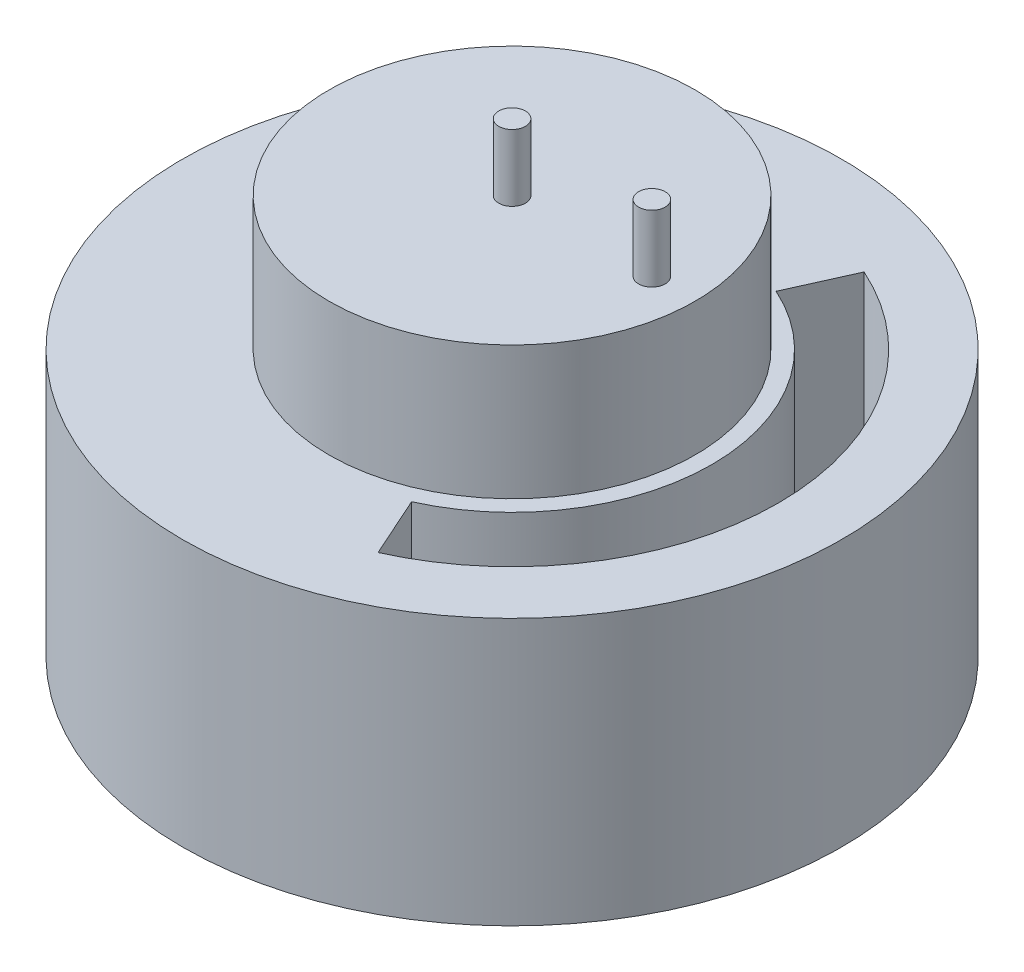
ISO-10303-21;
HEADER;
FILE_DESCRIPTION(('STEP AP214'),'2;1');
FILE_NAME('part.step','',(''),(''),'','','');
FILE_SCHEMA(('AUTOMOTIVE_DESIGN { 1 0 10303 214 1 1 1 1 }'));
ENDSEC;
DATA;
#1=APPLICATION_CONTEXT('core data for automotive mechanical design processes');
#2=APPLICATION_PROTOCOL_DEFINITION('international standard','automotive_design',2000,#1);
#3=PRODUCT_CONTEXT('',#1,'mechanical');
#4=PRODUCT('Part','Part','',(#3));
#5=PRODUCT_RELATED_PRODUCT_CATEGORY('part','',(#4));
#6=PRODUCT_DEFINITION_FORMATION('','',#4);
#7=PRODUCT_DEFINITION_CONTEXT('part definition',#1,'design');
#8=PRODUCT_DEFINITION('design','',#6,#7);
#9=PRODUCT_DEFINITION_SHAPE('','',#8);
#10=(LENGTH_UNIT() NAMED_UNIT(*) SI_UNIT(.MILLI.,.METRE.));
#11=(NAMED_UNIT(*) PLANE_ANGLE_UNIT() SI_UNIT($,.RADIAN.));
#12=(NAMED_UNIT(*) SI_UNIT($,.STERADIAN.) SOLID_ANGLE_UNIT());
#13=UNCERTAINTY_MEASURE_WITH_UNIT(LENGTH_MEASURE(1.E-05),#10,'distance_accuracy_value','');
#14=(GEOMETRIC_REPRESENTATION_CONTEXT(3) GLOBAL_UNCERTAINTY_ASSIGNED_CONTEXT((#13)) GLOBAL_UNIT_ASSIGNED_CONTEXT((#10,
#11,#12)) REPRESENTATION_CONTEXT('',''));
#15=CARTESIAN_POINT('',(0.,0.,0.));
#16=DIRECTION('',(0.,0.,1.));
#17=DIRECTION('',(1.,0.,0.));
#18=AXIS2_PLACEMENT_3D('',#15,#16,#17);
#19=CARTESIAN_POINT('',(0.,20.,0.));
#20=DIRECTION('',(0.,-1.,0.));
#21=DIRECTION('',(0.,0.,-1.));
#22=AXIS2_PLACEMENT_3D('',#19,#20,#21);
#23=CYLINDRICAL_SURFACE('',#22,24.75);
#24=CARTESIAN_POINT('',(0.,20.,0.));
#25=DIRECTION('',(0.,1.,0.));
#26=DIRECTION('',(0.,0.,1.));
#27=AXIS2_PLACEMENT_3D('',#24,#25,#26);
#28=CIRCLE('',#27,24.75);
#29=CARTESIAN_POINT('',(0.,20.,24.75));
#30=VERTEX_POINT('',#29);
#31=EDGE_CURVE('E50',#30,#30,#28,.T.);
#32=ORIENTED_EDGE('',*,*,#31,.F.);
#33=EDGE_LOOP('',(#32));
#34=FACE_BOUND('',#33,.T.);
#35=CARTESIAN_POINT('',(0.,0.,0.));
#36=DIRECTION('',(0.,1.,0.));
#37=DIRECTION('',(0.,0.,1.));
#38=AXIS2_PLACEMENT_3D('',#35,#36,#37);
#39=CIRCLE('',#38,24.75);
#40=CARTESIAN_POINT('',(0.,0.,24.75));
#41=VERTEX_POINT('',#40);
#42=EDGE_CURVE('E44',#41,#41,#39,.T.);
#43=ORIENTED_EDGE('',*,*,#42,.T.);
#44=EDGE_LOOP('',(#43));
#45=FACE_BOUND('',#44,.T.);
#46=ADVANCED_FACE('F41',(#34,#45),#23,.T.);
#47=CARTESIAN_POINT('',(0.,20.,0.));
#48=DIRECTION('',(0.,1.,0.));
#49=DIRECTION('',(0.,0.,1.));
#50=AXIS2_PLACEMENT_3D('',#47,#48,#49);
#51=PLANE('',#50);
#52=CARTESIAN_POINT('',(0.,20.,0.));
#53=DIRECTION('',(0.,-1.,0.));
#54=DIRECTION('',(0.,0.,1.));
#55=AXIS2_PLACEMENT_3D('',#52,#53,#54);
#56=CIRCLE('',#55,15.);
#57=CARTESIAN_POINT('',(6.13929231044262,20.,-13.6860911120356));
#58=VERTEX_POINT('',#57);
#59=CARTESIAN_POINT('',(6.13929231044262,20.,13.6860911120356));
#60=VERTEX_POINT('',#59);
#61=EDGE_CURVE('E58',#58,#60,#56,.T.);
#62=ORIENTED_EDGE('',*,*,#61,.F.);
#63=DIRECTION('',(-0.409286154029508,0.,0.912406074135707));
#64=VECTOR('',#63,1.);
#65=CARTESIAN_POINT('',(8.18572308059016,20.,-18.2481214827141));
#66=LINE('',#65,#64);
#67=CARTESIAN_POINT('',(8.18572308059016,20.,-18.2481214827141));
#68=VERTEX_POINT('',#67);
#69=EDGE_CURVE('E105',#68,#58,#66,.T.);
#70=ORIENTED_EDGE('',*,*,#69,.F.);
#71=CARTESIAN_POINT('',(0.,20.,0.));
#72=DIRECTION('',(0.,1.,0.));
#73=DIRECTION('',(0.,0.,1.));
#74=AXIS2_PLACEMENT_3D('',#71,#72,#73);
#75=CIRCLE('',#74,20.);
#76=CARTESIAN_POINT('',(8.18572308059016,20.,18.2481214827141));
#77=VERTEX_POINT('',#76);
#78=EDGE_CURVE('E87',#77,#68,#75,.T.);
#79=ORIENTED_EDGE('',*,*,#78,.F.);
#80=DIRECTION('',(0.409286154029508,0.,0.912406074135707));
#81=VECTOR('',#80,1.);
#82=CARTESIAN_POINT('',(8.18572308059016,20.,18.2481214827141));
#83=LINE('',#82,#81);
#84=EDGE_CURVE('E97',#60,#77,#83,.T.);
#85=ORIENTED_EDGE('',*,*,#84,.F.);
#86=EDGE_LOOP('',(#62,#70,#79,#85));
#87=FACE_BOUND('',#86,.T.);
#88=CARTESIAN_POINT('',(0.,20.,0.));
#89=DIRECTION('',(0.,1.,0.));
#90=DIRECTION('',(0.,0.,1.));
#91=AXIS2_PLACEMENT_3D('',#88,#89,#90);
#92=CIRCLE('',#91,13.75);
#93=CARTESIAN_POINT('',(0.,20.,13.75));
#94=VERTEX_POINT('',#93);
#95=EDGE_CURVE('E11',#94,#94,#92,.T.);
#96=ORIENTED_EDGE('',*,*,#95,.F.);
#97=EDGE_LOOP('',(#96));
#98=FACE_BOUND('',#97,.T.);
#99=ORIENTED_EDGE('',*,*,#31,.T.);
#100=EDGE_LOOP('',(#99));
#101=FACE_BOUND('',#100,.T.);
#102=ADVANCED_FACE('F102',(#87,#98,#101),#51,.T.);
#103=CARTESIAN_POINT('',(0.,0.,0.));
#104=DIRECTION('',(0.,1.,0.));
#105=DIRECTION('',(0.,0.,1.));
#106=AXIS2_PLACEMENT_3D('',#103,#104,#105);
#107=PLANE('',#106);
#108=DIRECTION('',(0.409286154029508,0.,-0.912406074135707));
#109=VECTOR('',#108,1.);
#110=CARTESIAN_POINT('',(8.18572308059016,0.,-18.2481214827141));
#111=LINE('',#110,#109);
#112=CARTESIAN_POINT('',(6.13929231044262,0.,-13.6860911120356));
#113=VERTEX_POINT('',#112);
#114=CARTESIAN_POINT('',(8.18572308059016,0.,-18.2481214827141));
#115=VERTEX_POINT('',#114);
#116=EDGE_CURVE('E282',#113,#115,#111,.T.);
#117=ORIENTED_EDGE('',*,*,#116,.F.);
#118=CARTESIAN_POINT('',(0.,0.,0.));
#119=DIRECTION('',(0.,1.,0.));
#120=DIRECTION('',(0.,0.,1.));
#121=AXIS2_PLACEMENT_3D('',#118,#119,#120);
#122=CIRCLE('',#121,15.);
#123=CARTESIAN_POINT('',(6.13929231044262,0.,13.6860911120356));
#124=VERTEX_POINT('',#123);
#125=EDGE_CURVE('E123',#124,#113,#122,.T.);
#126=ORIENTED_EDGE('',*,*,#125,.F.);
#127=DIRECTION('',(-0.409286154029508,0.,-0.912406074135707));
#128=VECTOR('',#127,1.);
#129=CARTESIAN_POINT('',(8.18572308059016,0.,18.2481214827141));
#130=LINE('',#129,#128);
#131=CARTESIAN_POINT('',(8.18572308059017,0.,18.2481214827142));
#132=VERTEX_POINT('',#131);
#133=EDGE_CURVE('E119',#132,#124,#130,.T.);
#134=ORIENTED_EDGE('',*,*,#133,.F.);
#135=CARTESIAN_POINT('',(0.,0.,0.));
#136=DIRECTION('',(0.,1.,0.));
#137=DIRECTION('',(0.,0.,1.));
#138=AXIS2_PLACEMENT_3D('',#135,#136,#137);
#139=CIRCLE('',#138,20.);
#140=EDGE_CURVE('E90',#115,#132,#139,.F.);
#141=ORIENTED_EDGE('',*,*,#140,.F.);
#142=EDGE_LOOP('',(#117,#126,#134,#141));
#143=FACE_BOUND('',#142,.T.);
#144=ORIENTED_EDGE('',*,*,#42,.F.);
#145=EDGE_LOOP('',(#144));
#146=FACE_BOUND('',#145,.T.);
#147=ADVANCED_FACE('F151',(#143,#146),#107,.F.);
#148=CARTESIAN_POINT('',(0.,30.,0.));
#149=DIRECTION('',(0.,-1.,0.));
#150=DIRECTION('',(0.,0.,-1.));
#151=AXIS2_PLACEMENT_3D('',#148,#149,#150);
#152=CYLINDRICAL_SURFACE('',#151,13.75);
#153=CARTESIAN_POINT('',(0.,30.,0.));
#154=DIRECTION('',(0.,1.,0.));
#155=DIRECTION('',(0.,0.,1.));
#156=AXIS2_PLACEMENT_3D('',#153,#154,#155);
#157=CIRCLE('',#156,13.75);
#158=CARTESIAN_POINT('',(0.,30.,13.75));
#159=VERTEX_POINT('',#158);
#160=EDGE_CURVE('E136',#159,#159,#157,.T.);
#161=ORIENTED_EDGE('',*,*,#160,.F.);
#162=EDGE_LOOP('',(#161));
#163=FACE_BOUND('',#162,.T.);
#164=ORIENTED_EDGE('',*,*,#95,.T.);
#165=EDGE_LOOP('',(#164));
#166=FACE_BOUND('',#165,.T.);
#167=ADVANCED_FACE('F153',(#163,#166),#152,.T.);
#168=CARTESIAN_POINT('',(0.,30.,0.));
#169=DIRECTION('',(0.,1.,0.));
#170=DIRECTION('',(0.,0.,1.));
#171=AXIS2_PLACEMENT_3D('',#168,#169,#170);
#172=PLANE('',#171);
#173=CARTESIAN_POINT('',(10.5,30.,0.));
#174=DIRECTION('',(0.,1.,0.));
#175=DIRECTION('',(0.,0.,1.));
#176=AXIS2_PLACEMENT_3D('',#173,#174,#175);
#177=CIRCLE('',#176,1.);
#178=CARTESIAN_POINT('',(10.5,30.,1.));
#179=VERTEX_POINT('',#178);
#180=EDGE_CURVE('E122',#179,#179,#177,.T.);
#181=ORIENTED_EDGE('',*,*,#180,.F.);
#182=EDGE_LOOP('',(#181));
#183=FACE_BOUND('',#182,.T.);
#184=CARTESIAN_POINT('',(0.,30.,0.));
#185=DIRECTION('',(0.,1.,0.));
#186=DIRECTION('',(0.,0.,1.));
#187=AXIS2_PLACEMENT_3D('',#184,#185,#186);
#188=CIRCLE('',#187,1.);
#189=CARTESIAN_POINT('',(0.,30.,1.));
#190=VERTEX_POINT('',#189);
#191=EDGE_CURVE('E128',#190,#190,#188,.T.);
#192=ORIENTED_EDGE('',*,*,#191,.F.);
#193=EDGE_LOOP('',(#192));
#194=FACE_BOUND('',#193,.T.);
#195=ORIENTED_EDGE('',*,*,#160,.T.);
#196=EDGE_LOOP('',(#195));
#197=FACE_BOUND('',#196,.T.);
#198=ADVANCED_FACE('F159',(#183,#194,#197),#172,.T.);
#199=CARTESIAN_POINT('',(0.,35.,0.));
#200=DIRECTION('',(0.,-1.,0.));
#201=DIRECTION('',(0.,0.,-1.));
#202=AXIS2_PLACEMENT_3D('',#199,#200,#201);
#203=CYLINDRICAL_SURFACE('',#202,1.);
#204=CARTESIAN_POINT('',(0.,35.,0.));
#205=DIRECTION('',(0.,1.,0.));
#206=DIRECTION('',(0.,0.,1.));
#207=AXIS2_PLACEMENT_3D('',#204,#205,#206);
#208=CIRCLE('',#207,1.);
#209=CARTESIAN_POINT('',(0.,35.,1.));
#210=VERTEX_POINT('',#209);
#211=EDGE_CURVE('E132',#210,#210,#208,.T.);
#212=ORIENTED_EDGE('',*,*,#211,.F.);
#213=EDGE_LOOP('',(#212));
#214=FACE_BOUND('',#213,.T.);
#215=ORIENTED_EDGE('',*,*,#191,.T.);
#216=EDGE_LOOP('',(#215));
#217=FACE_BOUND('',#216,.T.);
#218=ADVANCED_FACE('F233',(#214,#217),#203,.T.);
#219=CARTESIAN_POINT('',(0.,35.,0.));
#220=DIRECTION('',(0.,1.,0.));
#221=DIRECTION('',(0.,0.,1.));
#222=AXIS2_PLACEMENT_3D('',#219,#220,#221);
#223=PLANE('',#222);
#224=ORIENTED_EDGE('',*,*,#211,.T.);
#225=EDGE_LOOP('',(#224));
#226=FACE_BOUND('',#225,.T.);
#227=ADVANCED_FACE('F229',(#226),#223,.T.);
#228=CARTESIAN_POINT('',(10.5,35.,0.));
#229=DIRECTION('',(0.,-1.,0.));
#230=DIRECTION('',(0.,0.,-1.));
#231=AXIS2_PLACEMENT_3D('',#228,#229,#230);
#232=CYLINDRICAL_SURFACE('',#231,1.);
#233=CARTESIAN_POINT('',(10.5,35.,0.));
#234=DIRECTION('',(0.,1.,0.));
#235=DIRECTION('',(0.,0.,1.));
#236=AXIS2_PLACEMENT_3D('',#233,#234,#235);
#237=CIRCLE('',#236,1.);
#238=CARTESIAN_POINT('',(10.5,35.,1.));
#239=VERTEX_POINT('',#238);
#240=EDGE_CURVE('E124',#239,#239,#237,.T.);
#241=ORIENTED_EDGE('',*,*,#240,.F.);
#242=EDGE_LOOP('',(#241));
#243=FACE_BOUND('',#242,.T.);
#244=ORIENTED_EDGE('',*,*,#180,.T.);
#245=EDGE_LOOP('',(#244));
#246=FACE_BOUND('',#245,.T.);
#247=ADVANCED_FACE('F225',(#243,#246),#232,.T.);
#248=CARTESIAN_POINT('',(10.5,35.,0.));
#249=DIRECTION('',(0.,1.,0.));
#250=DIRECTION('',(0.,0.,1.));
#251=AXIS2_PLACEMENT_3D('',#248,#249,#250);
#252=PLANE('',#251);
#253=ORIENTED_EDGE('',*,*,#240,.T.);
#254=EDGE_LOOP('',(#253));
#255=FACE_BOUND('',#254,.T.);
#256=ADVANCED_FACE('F179',(#255),#252,.T.);
#257=CARTESIAN_POINT('',(0.,-39.0396589156069,0.));
#258=DIRECTION('',(0.,1.,0.));
#259=DIRECTION('',(0.,0.,1.));
#260=AXIS2_PLACEMENT_3D('',#257,#258,#259);
#261=CYLINDRICAL_SURFACE('',#260,15.);
#262=ORIENTED_EDGE('',*,*,#125,.T.);
#263=DIRECTION('',(0.,1.,0.));
#264=VECTOR('',#263,1.);
#265=CARTESIAN_POINT('',(6.13929231044262,-39.0396589156069,-13.6860911120356));
#266=LINE('',#265,#264);
#267=EDGE_CURVE('E112',#113,#58,#266,.T.);
#268=ORIENTED_EDGE('',*,*,#267,.T.);
#269=ORIENTED_EDGE('',*,*,#61,.T.);
#270=DIRECTION('',(0.,1.,0.));
#271=VECTOR('',#270,1.);
#272=CARTESIAN_POINT('',(6.13929231044262,-39.0396589156069,13.6860911120356));
#273=LINE('',#272,#271);
#274=EDGE_CURVE('E94',#124,#60,#273,.T.);
#275=ORIENTED_EDGE('',*,*,#274,.F.);
#276=EDGE_LOOP('',(#262,#268,#269,#275));
#277=FACE_BOUND('',#276,.T.);
#278=ADVANCED_FACE('F189',(#277),#261,.T.);
#279=CARTESIAN_POINT('',(8.18572308059016,-39.0396589156069,-18.2481214827141));
#280=DIRECTION('',(-0.912406074135707,0.,-0.409286154029508));
#281=DIRECTION('',(-0.409286154029508,0.,0.912406074135707));
#282=AXIS2_PLACEMENT_3D('',#279,#280,#281);
#283=PLANE('',#282);
#284=ORIENTED_EDGE('',*,*,#116,.T.);
#285=DIRECTION('',(0.,1.,0.));
#286=VECTOR('',#285,1.);
#287=CARTESIAN_POINT('',(8.18572308059016,-39.0396589156069,-18.2481214827141));
#288=LINE('',#287,#286);
#289=EDGE_CURVE('E93',#115,#68,#288,.T.);
#290=ORIENTED_EDGE('',*,*,#289,.T.);
#291=ORIENTED_EDGE('',*,*,#69,.T.);
#292=ORIENTED_EDGE('',*,*,#267,.F.);
#293=EDGE_LOOP('',(#284,#290,#291,#292));
#294=FACE_BOUND('',#293,.T.);
#295=ADVANCED_FACE('F194',(#294),#283,.F.);
#296=CARTESIAN_POINT('',(0.,-39.0396589156069,0.));
#297=DIRECTION('',(0.,1.,0.));
#298=DIRECTION('',(0.,0.,1.));
#299=AXIS2_PLACEMENT_3D('',#296,#297,#298);
#300=CYLINDRICAL_SURFACE('',#299,20.);
#301=ORIENTED_EDGE('',*,*,#140,.T.);
#302=DIRECTION('',(0.,1.,0.));
#303=VECTOR('',#302,1.);
#304=CARTESIAN_POINT('',(8.18572308059016,-39.0396589156069,18.2481214827141));
#305=LINE('',#304,#303);
#306=EDGE_CURVE('E66',#132,#77,#305,.T.);
#307=ORIENTED_EDGE('',*,*,#306,.T.);
#308=ORIENTED_EDGE('',*,*,#78,.T.);
#309=ORIENTED_EDGE('',*,*,#289,.F.);
#310=EDGE_LOOP('',(#301,#307,#308,#309));
#311=FACE_BOUND('',#310,.T.);
#312=ADVANCED_FACE('F84',(#311),#300,.F.);
#313=CARTESIAN_POINT('',(8.18572308059016,-39.0396589156069,18.2481214827141));
#314=DIRECTION('',(-0.912406074135707,0.,0.409286154029508));
#315=DIRECTION('',(0.409286154029508,0.,0.912406074135707));
#316=AXIS2_PLACEMENT_3D('',#313,#314,#315);
#317=PLANE('',#316);
#318=ORIENTED_EDGE('',*,*,#133,.T.);
#319=ORIENTED_EDGE('',*,*,#274,.T.);
#320=ORIENTED_EDGE('',*,*,#84,.T.);
#321=ORIENTED_EDGE('',*,*,#306,.F.);
#322=EDGE_LOOP('',(#318,#319,#320,#321));
#323=FACE_BOUND('',#322,.T.);
#324=ADVANCED_FACE('F98',(#323),#317,.F.);
#325=CLOSED_SHELL('',(#46,#102,#147,#167,#198,#218,#227,#247,#256,#278,#295,#312,#324));
#326=MANIFOLD_SOLID_BREP('B2',#325);
#327=ADVANCED_BREP_SHAPE_REPRESENTATION('',(#18,#326),#14);
#328=SHAPE_DEFINITION_REPRESENTATION(#9,#327);
ENDSEC;
END-ISO-10303-21;
